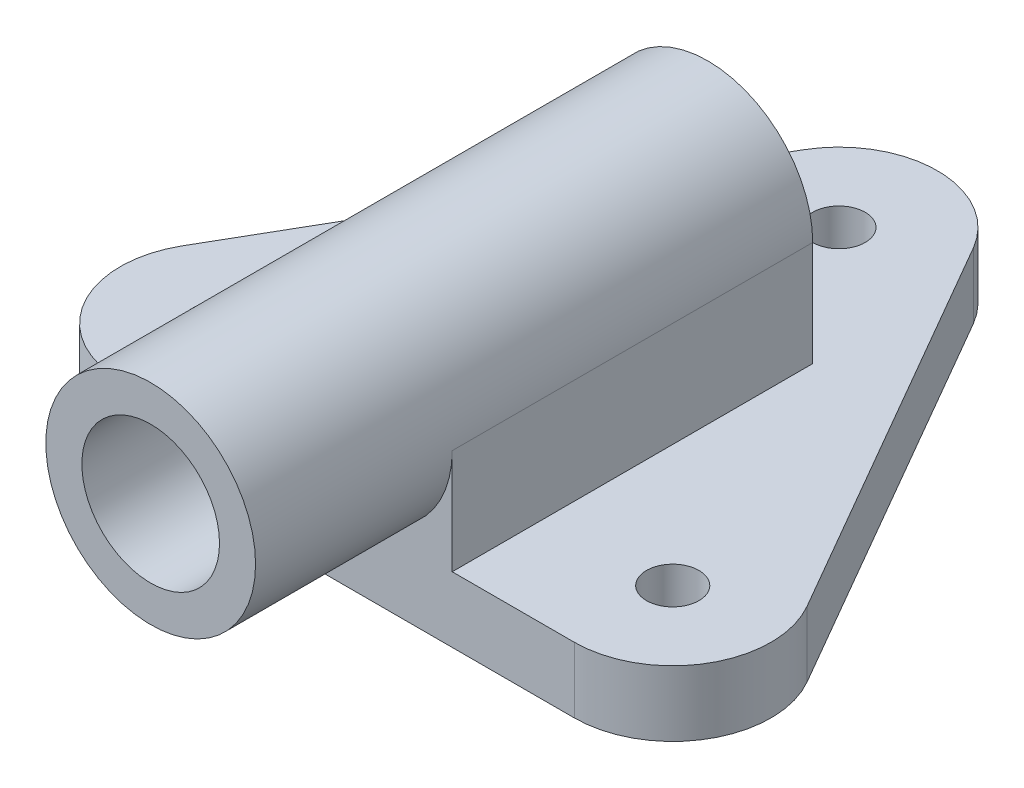
ISO-10303-21;
HEADER;
FILE_DESCRIPTION(('STEP AP214'),'2;1');
FILE_NAME('part.step','',(''),(''),'','','');
FILE_SCHEMA(('AUTOMOTIVE_DESIGN { 1 0 10303 214 1 1 1 1 }'));
ENDSEC;
DATA;
#1=APPLICATION_CONTEXT('core data for automotive mechanical design processes');
#2=APPLICATION_PROTOCOL_DEFINITION('international standard','automotive_design',2000,#1);
#3=PRODUCT_CONTEXT('',#1,'mechanical');
#4=PRODUCT('Part','Part','',(#3));
#5=PRODUCT_RELATED_PRODUCT_CATEGORY('part','',(#4));
#6=PRODUCT_DEFINITION_FORMATION('','',#4);
#7=PRODUCT_DEFINITION_CONTEXT('part definition',#1,'design');
#8=PRODUCT_DEFINITION('design','',#6,#7);
#9=PRODUCT_DEFINITION_SHAPE('','',#8);
#10=(LENGTH_UNIT() NAMED_UNIT(*) SI_UNIT(.MILLI.,.METRE.));
#11=(NAMED_UNIT(*) PLANE_ANGLE_UNIT() SI_UNIT($,.RADIAN.));
#12=(NAMED_UNIT(*) SI_UNIT($,.STERADIAN.) SOLID_ANGLE_UNIT());
#13=UNCERTAINTY_MEASURE_WITH_UNIT(LENGTH_MEASURE(1.E-05),#10,'distance_accuracy_value','');
#14=(GEOMETRIC_REPRESENTATION_CONTEXT(3) GLOBAL_UNCERTAINTY_ASSIGNED_CONTEXT((#13)) GLOBAL_UNIT_ASSIGNED_CONTEXT((#10,
#11,#12)) REPRESENTATION_CONTEXT('',''));
#15=CARTESIAN_POINT('',(0.,0.,0.));
#16=DIRECTION('',(0.,0.,1.));
#17=DIRECTION('',(1.,0.,0.));
#18=AXIS2_PLACEMENT_3D('',#15,#16,#17);
#19=CARTESIAN_POINT('',(0.,26.,105.));
#20=DIRECTION('',(0.,0.,-1.));
#21=DIRECTION('',(-1.,0.,0.));
#22=AXIS2_PLACEMENT_3D('',#19,#20,#21);
#23=CYLINDRICAL_SURFACE('',#22,16.);
#24=CARTESIAN_POINT('',(0.,26.,105.));
#25=DIRECTION('',(0.,0.,1.));
#26=DIRECTION('',(1.,0.,0.));
#27=AXIS2_PLACEMENT_3D('',#24,#25,#26);
#28=CIRCLE('',#27,16.);
#29=CARTESIAN_POINT('',(16.,26.,105.));
#30=VERTEX_POINT('',#29);
#31=EDGE_CURVE('E217',#30,#30,#28,.T.);
#32=ORIENTED_EDGE('',*,*,#31,.F.);
#33=EDGE_LOOP('',(#32));
#34=FACE_BOUND('',#33,.T.);
#35=DIRECTION('',(0.,0.,-1.));
#36=VECTOR('',#35,1.);
#37=CARTESIAN_POINT('',(-16.,26.,75.));
#38=LINE('',#37,#36);
#39=CARTESIAN_POINT('',(-16.,26.,75.));
#40=VERTEX_POINT('',#39);
#41=CARTESIAN_POINT('',(-16.,26.,20.));
#42=VERTEX_POINT('',#41);
#43=EDGE_CURVE('E225',#40,#42,#38,.T.);
#44=ORIENTED_EDGE('',*,*,#43,.F.);
#45=CARTESIAN_POINT('',(0.,26.,75.));
#46=DIRECTION('',(0.,0.,1.));
#47=DIRECTION('',(1.,0.,0.));
#48=AXIS2_PLACEMENT_3D('',#45,#46,#47);
#49=CIRCLE('',#48,16.);
#50=CARTESIAN_POINT('',(16.,26.,75.));
#51=VERTEX_POINT('',#50);
#52=EDGE_CURVE('E239',#40,#51,#49,.T.);
#53=ORIENTED_EDGE('',*,*,#52,.T.);
#54=DIRECTION('',(0.,0.,-1.));
#55=VECTOR('',#54,1.);
#56=CARTESIAN_POINT('',(16.,26.,75.));
#57=LINE('',#56,#55);
#58=CARTESIAN_POINT('',(16.,26.,20.));
#59=VERTEX_POINT('',#58);
#60=EDGE_CURVE('E241',#51,#59,#57,.T.);
#61=ORIENTED_EDGE('',*,*,#60,.T.);
#62=CARTESIAN_POINT('',(0.,26.,20.));
#63=DIRECTION('',(0.,0.,1.));
#64=DIRECTION('',(1.,0.,0.));
#65=AXIS2_PLACEMENT_3D('',#62,#63,#64);
#66=CIRCLE('',#65,16.);
#67=EDGE_CURVE('E233',#59,#42,#66,.T.);
#68=ORIENTED_EDGE('',*,*,#67,.T.);
#69=EDGE_LOOP('',(#44,#53,#61,#68));
#70=FACE_BOUND('',#69,.T.);
#71=ADVANCED_FACE('F60',(#34,#70),#23,.T.);
#72=CARTESIAN_POINT('',(34.6410161513775,10.,60.));
#73=DIRECTION('',(0.,1.,0.));
#74=DIRECTION('',(0.,0.,1.));
#75=AXIS2_PLACEMENT_3D('',#72,#73,#74);
#76=PLANE('',#75);
#77=DIRECTION('',(0.,0.,-1.));
#78=VECTOR('',#77,1.);
#79=CARTESIAN_POINT('',(-16.,10.,75.));
#80=LINE('',#79,#78);
#81=CARTESIAN_POINT('',(-16.,10.,75.));
#82=VERTEX_POINT('',#81);
#83=CARTESIAN_POINT('',(-16.,10.,20.));
#84=VERTEX_POINT('',#83);
#85=EDGE_CURVE('E199',#82,#84,#80,.T.);
#86=ORIENTED_EDGE('',*,*,#85,.T.);
#87=DIRECTION('',(-1.,0.,0.));
#88=VECTOR('',#87,1.);
#89=CARTESIAN_POINT('',(0.,10.,20.));
#90=LINE('',#89,#88);
#91=CARTESIAN_POINT('',(16.,10.,20.));
#92=VERTEX_POINT('',#91);
#93=EDGE_CURVE('E211',#92,#84,#90,.T.);
#94=ORIENTED_EDGE('',*,*,#93,.F.);
#95=DIRECTION('',(0.,0.,-1.));
#96=VECTOR('',#95,1.);
#97=CARTESIAN_POINT('',(16.,10.,75.));
#98=LINE('',#97,#96);
#99=CARTESIAN_POINT('',(16.,10.,75.));
#100=VERTEX_POINT('',#99);
#101=EDGE_CURVE('E191',#100,#92,#98,.T.);
#102=ORIENTED_EDGE('',*,*,#101,.F.);
#103=DIRECTION('',(1.,0.,0.));
#104=VECTOR('',#103,1.);
#105=CARTESIAN_POINT('',(34.6410161513775,10.,75.));
#106=LINE('',#105,#104);
#107=CARTESIAN_POINT('',(34.6410161513775,10.,75.));
#108=VERTEX_POINT('',#107);
#109=EDGE_CURVE('E74',#100,#108,#106,.T.);
#110=ORIENTED_EDGE('',*,*,#109,.T.);
#111=CARTESIAN_POINT('',(34.6410161513775,10.,60.));
#112=DIRECTION('',(0.,1.,0.));
#113=DIRECTION('',(0.,0.,1.));
#114=AXIS2_PLACEMENT_3D('',#111,#112,#113);
#115=CIRCLE('',#114,15.);
#116=CARTESIAN_POINT('',(47.6313972081441,10.,52.5));
#117=VERTEX_POINT('',#116);
#118=EDGE_CURVE('E162',#108,#117,#115,.T.);
#119=ORIENTED_EDGE('',*,*,#118,.T.);
#120=DIRECTION('',(-0.5,0.,-0.866025403784439));
#121=VECTOR('',#120,1.);
#122=CARTESIAN_POINT('',(12.9903810567666,10.,-7.5));
#123=LINE('',#122,#121);
#124=CARTESIAN_POINT('',(12.9903810567666,10.,-7.5));
#125=VERTEX_POINT('',#124);
#126=EDGE_CURVE('E114',#117,#125,#123,.T.);
#127=ORIENTED_EDGE('',*,*,#126,.T.);
#128=CARTESIAN_POINT('',(0.,10.,0.));
#129=DIRECTION('',(0.,1.,0.));
#130=DIRECTION('',(0.,0.,1.));
#131=AXIS2_PLACEMENT_3D('',#128,#129,#130);
#132=CIRCLE('',#131,15.);
#133=CARTESIAN_POINT('',(-12.9903810567666,10.,-7.5));
#134=VERTEX_POINT('',#133);
#135=EDGE_CURVE('E131',#125,#134,#132,.T.);
#136=ORIENTED_EDGE('',*,*,#135,.T.);
#137=DIRECTION('',(-0.5,0.,0.866025403784439));
#138=VECTOR('',#137,1.);
#139=CARTESIAN_POINT('',(-47.6313972081441,10.,52.5));
#140=LINE('',#139,#138);
#141=CARTESIAN_POINT('',(-47.6313972081441,10.,52.5));
#142=VERTEX_POINT('',#141);
#143=EDGE_CURVE('E123',#134,#142,#140,.T.);
#144=ORIENTED_EDGE('',*,*,#143,.T.);
#145=CARTESIAN_POINT('',(-34.6410161513775,10.,60.));
#146=DIRECTION('',(0.,1.,0.));
#147=DIRECTION('',(0.,0.,1.));
#148=AXIS2_PLACEMENT_3D('',#145,#146,#147);
#149=CIRCLE('',#148,15.);
#150=CARTESIAN_POINT('',(-34.6410161513775,10.,75.));
#151=VERTEX_POINT('',#150);
#152=EDGE_CURVE('E128',#142,#151,#149,.T.);
#153=ORIENTED_EDGE('',*,*,#152,.T.);
#154=EDGE_CURVE('E150',#151,#82,#106,.T.);
#155=ORIENTED_EDGE('',*,*,#154,.T.);
#156=EDGE_LOOP('',(#86,#94,#102,#110,#119,#127,#136,#144,#153,#155));
#157=FACE_BOUND('',#156,.T.);
#158=CARTESIAN_POINT('',(0.,10.,0.));
#159=DIRECTION('',(0.,1.,0.));
#160=DIRECTION('',(0.,0.,1.));
#161=AXIS2_PLACEMENT_3D('',#158,#159,#160);
#162=CIRCLE('',#161,4.);
#163=CARTESIAN_POINT('',(0.,10.,4.));
#164=VERTEX_POINT('',#163);
#165=EDGE_CURVE('E254',#164,#164,#162,.T.);
#166=ORIENTED_EDGE('',*,*,#165,.F.);
#167=EDGE_LOOP('',(#166));
#168=FACE_BOUND('',#167,.T.);
#169=CARTESIAN_POINT('',(34.6410161513775,10.,60.));
#170=DIRECTION('',(0.,1.,0.));
#171=DIRECTION('',(0.,0.,1.));
#172=AXIS2_PLACEMENT_3D('',#169,#170,#171);
#173=CIRCLE('',#172,4.);
#174=CARTESIAN_POINT('',(34.6410161513775,10.,64.));
#175=VERTEX_POINT('',#174);
#176=EDGE_CURVE('E156',#175,#175,#173,.T.);
#177=ORIENTED_EDGE('',*,*,#176,.F.);
#178=EDGE_LOOP('',(#177));
#179=FACE_BOUND('',#178,.T.);
#180=CARTESIAN_POINT('',(-34.6410161513775,10.,60.));
#181=DIRECTION('',(0.,1.,0.));
#182=DIRECTION('',(0.,0.,1.));
#183=AXIS2_PLACEMENT_3D('',#180,#181,#182);
#184=CIRCLE('',#183,3.99999999999999);
#185=CARTESIAN_POINT('',(-34.6410161513775,10.,64.));
#186=VERTEX_POINT('',#185);
#187=EDGE_CURVE('E247',#186,#186,#184,.T.);
#188=ORIENTED_EDGE('',*,*,#187,.F.);
#189=EDGE_LOOP('',(#188));
#190=FACE_BOUND('',#189,.T.);
#191=ADVANCED_FACE('F127',(#157,#168,#179,#190),#76,.T.);
#192=CARTESIAN_POINT('',(34.6410161513775,0.,60.));
#193=DIRECTION('',(0.,1.,0.));
#194=DIRECTION('',(0.,0.,1.));
#195=AXIS2_PLACEMENT_3D('',#192,#193,#194);
#196=PLANE('',#195);
#197=CARTESIAN_POINT('',(34.6410161513775,0.,60.));
#198=DIRECTION('',(0.,1.,0.));
#199=DIRECTION('',(0.,0.,1.));
#200=AXIS2_PLACEMENT_3D('',#197,#198,#199);
#201=CIRCLE('',#200,15.);
#202=CARTESIAN_POINT('',(34.6410161513775,0.,75.));
#203=VERTEX_POINT('',#202);
#204=CARTESIAN_POINT('',(47.6313972081441,0.,52.5));
#205=VERTEX_POINT('',#204);
#206=EDGE_CURVE('E155',#203,#205,#201,.T.);
#207=ORIENTED_EDGE('',*,*,#206,.F.);
#208=DIRECTION('',(1.,0.,0.));
#209=VECTOR('',#208,1.);
#210=CARTESIAN_POINT('',(34.6410161513775,0.,75.));
#211=LINE('',#210,#209);
#212=CARTESIAN_POINT('',(-34.6410161513775,0.,75.));
#213=VERTEX_POINT('',#212);
#214=EDGE_CURVE('E104',#213,#203,#211,.T.);
#215=ORIENTED_EDGE('',*,*,#214,.F.);
#216=CARTESIAN_POINT('',(-34.6410161513775,0.,60.));
#217=DIRECTION('',(0.,1.,0.));
#218=DIRECTION('',(0.,0.,1.));
#219=AXIS2_PLACEMENT_3D('',#216,#217,#218);
#220=CIRCLE('',#219,15.);
#221=CARTESIAN_POINT('',(-47.6313972081441,0.,52.5));
#222=VERTEX_POINT('',#221);
#223=EDGE_CURVE('E97',#222,#213,#220,.T.);
#224=ORIENTED_EDGE('',*,*,#223,.F.);
#225=DIRECTION('',(-0.5,0.,0.866025403784439));
#226=VECTOR('',#225,1.);
#227=CARTESIAN_POINT('',(-47.6313972081441,0.,52.5));
#228=LINE('',#227,#226);
#229=CARTESIAN_POINT('',(-12.9903810567666,0.,-7.5));
#230=VERTEX_POINT('',#229);
#231=EDGE_CURVE('E139',#230,#222,#228,.T.);
#232=ORIENTED_EDGE('',*,*,#231,.F.);
#233=CARTESIAN_POINT('',(0.,0.,0.));
#234=DIRECTION('',(0.,1.,0.));
#235=DIRECTION('',(0.,0.,1.));
#236=AXIS2_PLACEMENT_3D('',#233,#234,#235);
#237=CIRCLE('',#236,15.);
#238=CARTESIAN_POINT('',(12.9903810567666,0.,-7.5));
#239=VERTEX_POINT('',#238);
#240=EDGE_CURVE('E158',#239,#230,#237,.T.);
#241=ORIENTED_EDGE('',*,*,#240,.F.);
#242=DIRECTION('',(-0.5,0.,-0.866025403784439));
#243=VECTOR('',#242,1.);
#244=CARTESIAN_POINT('',(12.9903810567666,0.,-7.5));
#245=LINE('',#244,#243);
#246=EDGE_CURVE('E154',#205,#239,#245,.T.);
#247=ORIENTED_EDGE('',*,*,#246,.F.);
#248=EDGE_LOOP('',(#207,#215,#224,#232,#241,#247));
#249=FACE_BOUND('',#248,.T.);
#250=CARTESIAN_POINT('',(34.6410161513775,0.,60.));
#251=DIRECTION('',(0.,1.,0.));
#252=DIRECTION('',(0.,0.,1.));
#253=AXIS2_PLACEMENT_3D('',#250,#251,#252);
#254=CIRCLE('',#253,4.);
#255=CARTESIAN_POINT('',(34.6410161513775,0.,64.));
#256=VERTEX_POINT('',#255);
#257=EDGE_CURVE('E256',#256,#256,#254,.T.);
#258=ORIENTED_EDGE('',*,*,#257,.T.);
#259=EDGE_LOOP('',(#258));
#260=FACE_BOUND('',#259,.T.);
#261=CARTESIAN_POINT('',(0.,0.,0.));
#262=DIRECTION('',(0.,1.,0.));
#263=DIRECTION('',(0.,0.,1.));
#264=AXIS2_PLACEMENT_3D('',#261,#262,#263);
#265=CIRCLE('',#264,4.);
#266=CARTESIAN_POINT('',(0.,0.,4.));
#267=VERTEX_POINT('',#266);
#268=EDGE_CURVE('E252',#267,#267,#265,.T.);
#269=ORIENTED_EDGE('',*,*,#268,.T.);
#270=EDGE_LOOP('',(#269));
#271=FACE_BOUND('',#270,.T.);
#272=CARTESIAN_POINT('',(-34.6410161513775,0.,60.));
#273=DIRECTION('',(0.,1.,0.));
#274=DIRECTION('',(0.,0.,1.));
#275=AXIS2_PLACEMENT_3D('',#272,#273,#274);
#276=CIRCLE('',#275,3.99999999999999);
#277=CARTESIAN_POINT('',(-34.6410161513775,0.,64.));
#278=VERTEX_POINT('',#277);
#279=EDGE_CURVE('E248',#278,#278,#276,.T.);
#280=ORIENTED_EDGE('',*,*,#279,.T.);
#281=EDGE_LOOP('',(#280));
#282=FACE_BOUND('',#281,.T.);
#283=ADVANCED_FACE('F171',(#249,#260,#271,#282),#196,.F.);
#284=CARTESIAN_POINT('',(34.6410161513775,10.,60.));
#285=DIRECTION('',(0.,-1.,0.));
#286=DIRECTION('',(0.,0.,-1.));
#287=AXIS2_PLACEMENT_3D('',#284,#285,#286);
#288=CYLINDRICAL_SURFACE('',#287,15.);
#289=ORIENTED_EDGE('',*,*,#206,.T.);
#290=DIRECTION('',(0.,-1.,0.));
#291=VECTOR('',#290,1.);
#292=CARTESIAN_POINT('',(47.6313972081441,10.,52.5));
#293=LINE('',#292,#291);
#294=EDGE_CURVE('E12',#117,#205,#293,.T.);
#295=ORIENTED_EDGE('',*,*,#294,.F.);
#296=ORIENTED_EDGE('',*,*,#118,.F.);
#297=DIRECTION('',(0.,-1.,0.));
#298=VECTOR('',#297,1.);
#299=CARTESIAN_POINT('',(34.6410161513775,10.,75.));
#300=LINE('',#299,#298);
#301=EDGE_CURVE('E151',#108,#203,#300,.T.);
#302=ORIENTED_EDGE('',*,*,#301,.T.);
#303=EDGE_LOOP('',(#289,#295,#296,#302));
#304=FACE_BOUND('',#303,.T.);
#305=ADVANCED_FACE('F56',(#304),#288,.T.);
#306=CARTESIAN_POINT('',(12.9903810567666,10.,-7.5));
#307=DIRECTION('',(-0.866025403784439,0.,0.5));
#308=DIRECTION('',(0.5,0.,0.866025403784439));
#309=AXIS2_PLACEMENT_3D('',#306,#307,#308);
#310=PLANE('',#309);
#311=ORIENTED_EDGE('',*,*,#246,.T.);
#312=DIRECTION('',(0.,-1.,0.));
#313=VECTOR('',#312,1.);
#314=CARTESIAN_POINT('',(12.9903810567666,10.,-7.5));
#315=LINE('',#314,#313);
#316=EDGE_CURVE('E66',#125,#239,#315,.T.);
#317=ORIENTED_EDGE('',*,*,#316,.F.);
#318=ORIENTED_EDGE('',*,*,#126,.F.);
#319=ORIENTED_EDGE('',*,*,#294,.T.);
#320=EDGE_LOOP('',(#311,#317,#318,#319));
#321=FACE_BOUND('',#320,.T.);
#322=ADVANCED_FACE('F318',(#321),#310,.F.);
#323=CARTESIAN_POINT('',(0.,10.,0.));
#324=DIRECTION('',(0.,-1.,0.));
#325=DIRECTION('',(0.,0.,-1.));
#326=AXIS2_PLACEMENT_3D('',#323,#324,#325);
#327=CYLINDRICAL_SURFACE('',#326,15.);
#328=ORIENTED_EDGE('',*,*,#240,.T.);
#329=DIRECTION('',(0.,-1.,0.));
#330=VECTOR('',#329,1.);
#331=CARTESIAN_POINT('',(-12.9903810567666,10.,-7.5));
#332=LINE('',#331,#330);
#333=EDGE_CURVE('E143',#134,#230,#332,.T.);
#334=ORIENTED_EDGE('',*,*,#333,.F.);
#335=ORIENTED_EDGE('',*,*,#135,.F.);
#336=ORIENTED_EDGE('',*,*,#316,.T.);
#337=EDGE_LOOP('',(#328,#334,#335,#336));
#338=FACE_BOUND('',#337,.T.);
#339=ADVANCED_FACE('F166',(#338),#327,.T.);
#340=CARTESIAN_POINT('',(-47.6313972081441,10.,52.5));
#341=DIRECTION('',(0.866025403784439,0.,0.5));
#342=DIRECTION('',(0.5,0.,-0.866025403784439));
#343=AXIS2_PLACEMENT_3D('',#340,#341,#342);
#344=PLANE('',#343);
#345=ORIENTED_EDGE('',*,*,#231,.T.);
#346=DIRECTION('',(0.,-1.,0.));
#347=VECTOR('',#346,1.);
#348=CARTESIAN_POINT('',(-47.6313972081441,10.,52.5));
#349=LINE('',#348,#347);
#350=EDGE_CURVE('E140',#142,#222,#349,.T.);
#351=ORIENTED_EDGE('',*,*,#350,.F.);
#352=ORIENTED_EDGE('',*,*,#143,.F.);
#353=ORIENTED_EDGE('',*,*,#333,.T.);
#354=EDGE_LOOP('',(#345,#351,#352,#353));
#355=FACE_BOUND('',#354,.T.);
#356=ADVANCED_FACE('F138',(#355),#344,.F.);
#357=CARTESIAN_POINT('',(-34.6410161513775,10.,60.));
#358=DIRECTION('',(0.,-1.,0.));
#359=DIRECTION('',(0.,0.,-1.));
#360=AXIS2_PLACEMENT_3D('',#357,#358,#359);
#361=CYLINDRICAL_SURFACE('',#360,15.);
#362=ORIENTED_EDGE('',*,*,#223,.T.);
#363=DIRECTION('',(0.,-1.,0.));
#364=VECTOR('',#363,1.);
#365=CARTESIAN_POINT('',(-34.6410161513775,10.,75.));
#366=LINE('',#365,#364);
#367=EDGE_CURVE('E142',#151,#213,#366,.T.);
#368=ORIENTED_EDGE('',*,*,#367,.F.);
#369=ORIENTED_EDGE('',*,*,#152,.F.);
#370=ORIENTED_EDGE('',*,*,#350,.T.);
#371=EDGE_LOOP('',(#362,#368,#369,#370));
#372=FACE_BOUND('',#371,.T.);
#373=ADVANCED_FACE('F145',(#372),#361,.T.);
#374=CARTESIAN_POINT('',(34.6410161513775,10.,75.));
#375=DIRECTION('',(0.,0.,-1.));
#376=DIRECTION('',(-1.,0.,0.));
#377=AXIS2_PLACEMENT_3D('',#374,#375,#376);
#378=PLANE('',#377);
#379=ORIENTED_EDGE('',*,*,#214,.T.);
#380=ORIENTED_EDGE('',*,*,#301,.F.);
#381=ORIENTED_EDGE('',*,*,#109,.F.);
#382=DIRECTION('',(0.,-1.,0.));
#383=VECTOR('',#382,1.);
#384=CARTESIAN_POINT('',(16.,0.,75.));
#385=LINE('',#384,#383);
#386=EDGE_CURVE('E185',#51,#100,#385,.T.);
#387=ORIENTED_EDGE('',*,*,#386,.F.);
#388=ORIENTED_EDGE('',*,*,#52,.F.);
#389=DIRECTION('',(0.,1.,0.));
#390=VECTOR('',#389,1.);
#391=CARTESIAN_POINT('',(-16.,0.,75.));
#392=LINE('',#391,#390);
#393=EDGE_CURVE('E224',#82,#40,#392,.T.);
#394=ORIENTED_EDGE('',*,*,#393,.F.);
#395=ORIENTED_EDGE('',*,*,#154,.F.);
#396=ORIENTED_EDGE('',*,*,#367,.T.);
#397=EDGE_LOOP('',(#379,#380,#381,#387,#388,#394,#395,#396));
#398=FACE_BOUND('',#397,.T.);
#399=ADVANCED_FACE('F180',(#398),#378,.F.);
#400=CARTESIAN_POINT('',(34.6410161513775,10.,60.));
#401=DIRECTION('',(0.,-1.,0.));
#402=DIRECTION('',(0.,0.,-1.));
#403=AXIS2_PLACEMENT_3D('',#400,#401,#402);
#404=CYLINDRICAL_SURFACE('',#403,4.);
#405=ORIENTED_EDGE('',*,*,#176,.T.);
#406=EDGE_LOOP('',(#405));
#407=FACE_BOUND('',#406,.T.);
#408=ORIENTED_EDGE('',*,*,#257,.F.);
#409=EDGE_LOOP('',(#408));
#410=FACE_BOUND('',#409,.T.);
#411=ADVANCED_FACE('F267',(#407,#410),#404,.F.);
#412=CARTESIAN_POINT('',(0.,10.,0.));
#413=DIRECTION('',(0.,-1.,0.));
#414=DIRECTION('',(0.,0.,-1.));
#415=AXIS2_PLACEMENT_3D('',#412,#413,#414);
#416=CYLINDRICAL_SURFACE('',#415,4.);
#417=ORIENTED_EDGE('',*,*,#165,.T.);
#418=EDGE_LOOP('',(#417));
#419=FACE_BOUND('',#418,.T.);
#420=ORIENTED_EDGE('',*,*,#268,.F.);
#421=EDGE_LOOP('',(#420));
#422=FACE_BOUND('',#421,.T.);
#423=ADVANCED_FACE('F271',(#419,#422),#416,.F.);
#424=CARTESIAN_POINT('',(-34.6410161513775,10.,60.));
#425=DIRECTION('',(0.,-1.,0.));
#426=DIRECTION('',(0.,0.,-1.));
#427=AXIS2_PLACEMENT_3D('',#424,#425,#426);
#428=CYLINDRICAL_SURFACE('',#427,3.99999999999999);
#429=ORIENTED_EDGE('',*,*,#187,.T.);
#430=EDGE_LOOP('',(#429));
#431=FACE_BOUND('',#430,.T.);
#432=ORIENTED_EDGE('',*,*,#279,.F.);
#433=EDGE_LOOP('',(#432));
#434=FACE_BOUND('',#433,.T.);
#435=ADVANCED_FACE('F279',(#431,#434),#428,.F.);
#436=CARTESIAN_POINT('',(16.,0.,75.));
#437=DIRECTION('',(1.,0.,0.));
#438=DIRECTION('',(0.,0.,-1.));
#439=AXIS2_PLACEMENT_3D('',#436,#437,#438);
#440=PLANE('',#439);
#441=DIRECTION('',(0.,-1.,0.));
#442=VECTOR('',#441,1.);
#443=CARTESIAN_POINT('',(16.,0.,20.));
#444=LINE('',#443,#442);
#445=EDGE_CURVE('E220',#59,#92,#444,.T.);
#446=ORIENTED_EDGE('',*,*,#445,.F.);
#447=ORIENTED_EDGE('',*,*,#60,.F.);
#448=ORIENTED_EDGE('',*,*,#386,.T.);
#449=ORIENTED_EDGE('',*,*,#101,.T.);
#450=EDGE_LOOP('',(#446,#447,#448,#449));
#451=FACE_BOUND('',#450,.T.);
#452=ADVANCED_FACE('F303',(#451),#440,.T.);
#453=CARTESIAN_POINT('',(0.,0.,20.));
#454=DIRECTION('',(0.,0.,1.));
#455=DIRECTION('',(1.,0.,0.));
#456=AXIS2_PLACEMENT_3D('',#453,#454,#455);
#457=PLANE('',#456);
#458=ORIENTED_EDGE('',*,*,#93,.T.);
#459=DIRECTION('',(0.,1.,0.));
#460=VECTOR('',#459,1.);
#461=CARTESIAN_POINT('',(-16.,0.,20.));
#462=LINE('',#461,#460);
#463=EDGE_CURVE('E214',#84,#42,#462,.T.);
#464=ORIENTED_EDGE('',*,*,#463,.T.);
#465=ORIENTED_EDGE('',*,*,#67,.F.);
#466=ORIENTED_EDGE('',*,*,#445,.T.);
#467=EDGE_LOOP('',(#458,#464,#465,#466));
#468=FACE_BOUND('',#467,.T.);
#469=CARTESIAN_POINT('',(0.,26.,20.));
#470=DIRECTION('',(0.,0.,1.));
#471=DIRECTION('',(1.,0.,0.));
#472=AXIS2_PLACEMENT_3D('',#469,#470,#471);
#473=CIRCLE('',#472,10.5);
#474=CARTESIAN_POINT('',(10.5,26.,20.));
#475=VERTEX_POINT('',#474);
#476=EDGE_CURVE('E229',#475,#475,#473,.T.);
#477=ORIENTED_EDGE('',*,*,#476,.T.);
#478=EDGE_LOOP('',(#477));
#479=FACE_BOUND('',#478,.T.);
#480=ADVANCED_FACE('F215',(#468,#479),#457,.F.);
#481=CARTESIAN_POINT('',(0.,26.,105.));
#482=DIRECTION('',(0.,0.,-1.));
#483=DIRECTION('',(-1.,0.,0.));
#484=AXIS2_PLACEMENT_3D('',#481,#482,#483);
#485=CYLINDRICAL_SURFACE('',#484,10.5);
#486=CARTESIAN_POINT('',(0.,26.,105.));
#487=DIRECTION('',(0.,0.,1.));
#488=DIRECTION('',(1.,0.,0.));
#489=AXIS2_PLACEMENT_3D('',#486,#487,#488);
#490=CIRCLE('',#489,10.5);
#491=CARTESIAN_POINT('',(10.5,26.,105.));
#492=VERTEX_POINT('',#491);
#493=EDGE_CURVE('E227',#492,#492,#490,.T.);
#494=ORIENTED_EDGE('',*,*,#493,.T.);
#495=EDGE_LOOP('',(#494));
#496=FACE_BOUND('',#495,.T.);
#497=ORIENTED_EDGE('',*,*,#476,.F.);
#498=EDGE_LOOP('',(#497));
#499=FACE_BOUND('',#498,.T.);
#500=ADVANCED_FACE('F296',(#496,#499),#485,.F.);
#501=CARTESIAN_POINT('',(0.,0.,105.));
#502=DIRECTION('',(0.,0.,1.));
#503=DIRECTION('',(1.,0.,0.));
#504=AXIS2_PLACEMENT_3D('',#501,#502,#503);
#505=PLANE('',#504);
#506=ORIENTED_EDGE('',*,*,#493,.F.);
#507=EDGE_LOOP('',(#506));
#508=FACE_BOUND('',#507,.T.);
#509=ORIENTED_EDGE('',*,*,#31,.T.);
#510=EDGE_LOOP('',(#509));
#511=FACE_BOUND('',#510,.T.);
#512=ADVANCED_FACE('F293',(#508,#511),#505,.T.);
#513=CARTESIAN_POINT('',(-16.,0.,75.));
#514=DIRECTION('',(-1.,0.,0.));
#515=DIRECTION('',(0.,0.,1.));
#516=AXIS2_PLACEMENT_3D('',#513,#514,#515);
#517=PLANE('',#516);
#518=ORIENTED_EDGE('',*,*,#463,.F.);
#519=ORIENTED_EDGE('',*,*,#85,.F.);
#520=ORIENTED_EDGE('',*,*,#393,.T.);
#521=ORIENTED_EDGE('',*,*,#43,.T.);
#522=EDGE_LOOP('',(#518,#519,#520,#521));
#523=FACE_BOUND('',#522,.T.);
#524=ADVANCED_FACE('F219',(#523),#517,.T.);
#525=CLOSED_SHELL('',(#71,#191,#283,#305,#322,#339,#356,#373,#399,#411,#423,#435,#452,#480,#500,
#512,#524));
#526=MANIFOLD_SOLID_BREP('B2',#525);
#527=ADVANCED_BREP_SHAPE_REPRESENTATION('',(#18,#526),#14);
#528=SHAPE_DEFINITION_REPRESENTATION(#9,#527);
ENDSEC;
END-ISO-10303-21;
